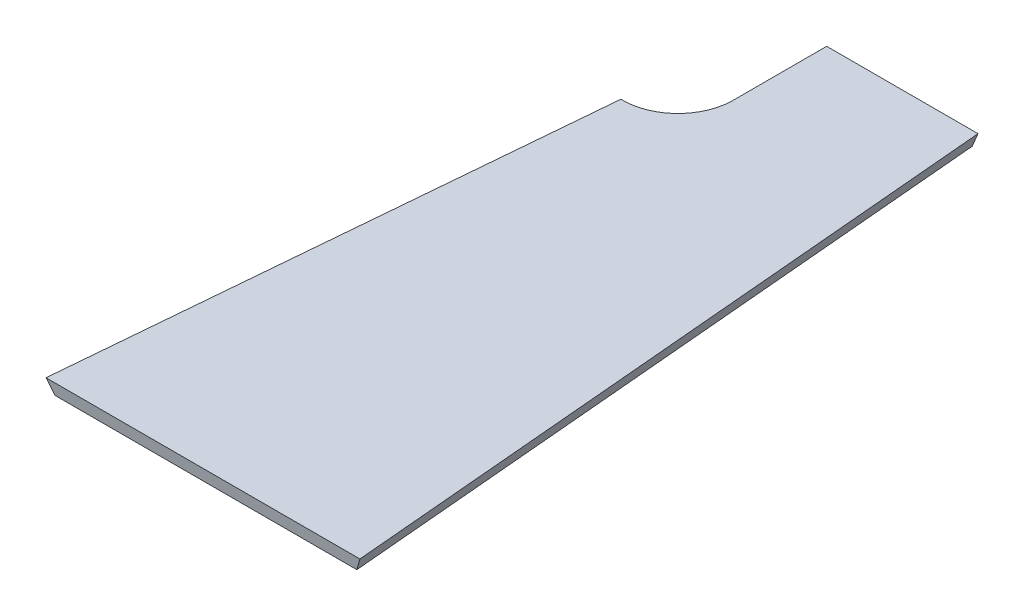
ISO-10303-21;
HEADER;
FILE_DESCRIPTION(('STEP AP214'),'2;1');
FILE_NAME('part.step','',(''),(''),'','','');
FILE_SCHEMA(('AUTOMOTIVE_DESIGN { 1 0 10303 214 1 1 1 1 }'));
ENDSEC;
DATA;
#1=APPLICATION_CONTEXT('core data for automotive mechanical design processes');
#2=APPLICATION_PROTOCOL_DEFINITION('international standard','automotive_design',2000,#1);
#3=PRODUCT_CONTEXT('',#1,'mechanical');
#4=PRODUCT('Part','Part','',(#3));
#5=PRODUCT_RELATED_PRODUCT_CATEGORY('part','',(#4));
#6=PRODUCT_DEFINITION_FORMATION('','',#4);
#7=PRODUCT_DEFINITION_CONTEXT('part definition',#1,'design');
#8=PRODUCT_DEFINITION('design','',#6,#7);
#9=PRODUCT_DEFINITION_SHAPE('','',#8);
#10=(LENGTH_UNIT() NAMED_UNIT(*) SI_UNIT(.MILLI.,.METRE.));
#11=(NAMED_UNIT(*) PLANE_ANGLE_UNIT() SI_UNIT($,.RADIAN.));
#12=(NAMED_UNIT(*) SI_UNIT($,.STERADIAN.) SOLID_ANGLE_UNIT());
#13=UNCERTAINTY_MEASURE_WITH_UNIT(LENGTH_MEASURE(1.E-05),#10,'distance_accuracy_value','');
#14=(GEOMETRIC_REPRESENTATION_CONTEXT(3) GLOBAL_UNCERTAINTY_ASSIGNED_CONTEXT((#13)) GLOBAL_UNIT_ASSIGNED_CONTEXT((#10,
#11,#12)) REPRESENTATION_CONTEXT('',''));
#15=CARTESIAN_POINT('',(0.,0.,0.));
#16=DIRECTION('',(0.,0.,1.));
#17=DIRECTION('',(1.,0.,0.));
#18=AXIS2_PLACEMENT_3D('',#15,#16,#17);
#19=CARTESIAN_POINT('',(-28.5,2.5,-61.5));
#20=DIRECTION('',(0.,0.,1.));
#21=DIRECTION('',(1.,0.,0.));
#22=AXIS2_PLACEMENT_3D('',#19,#20,#21);
#23=PLANE('',#22);
#24=DIRECTION('',(-1.,0.,0.));
#25=VECTOR('',#24,1.);
#26=CARTESIAN_POINT('',(-28.5,0.,-61.5));
#27=LINE('',#26,#25);
#28=CARTESIAN_POINT('',(16.6994049090877,0.,-61.5));
#29=VERTEX_POINT('',#28);
#30=CARTESIAN_POINT('',(-9.73889438631091,0.,-61.5));
#31=VERTEX_POINT('',#30);
#32=EDGE_CURVE('E168',#29,#31,#27,.T.);
#33=ORIENTED_EDGE('',*,*,#32,.T.);
#34=DIRECTION('',(0.,1.,0.));
#35=VECTOR('',#34,1.);
#36=CARTESIAN_POINT('',(-9.73889438631091,0.,-61.5));
#37=LINE('',#36,#35);
#38=CARTESIAN_POINT('',(-9.73889438631091,2.5,-61.5));
#39=VERTEX_POINT('',#38);
#40=EDGE_CURVE('E113',#31,#39,#37,.T.);
#41=ORIENTED_EDGE('',*,*,#40,.T.);
#42=DIRECTION('',(-1.,0.,0.));
#43=VECTOR('',#42,1.);
#44=CARTESIAN_POINT('',(-28.5,2.5,-61.5));
#45=LINE('',#44,#43);
#46=CARTESIAN_POINT('',(17.7388943863118,2.5,-61.5));
#47=VERTEX_POINT('',#46);
#48=EDGE_CURVE('E169',#47,#39,#45,.T.);
#49=ORIENTED_EDGE('',*,*,#48,.F.);
#50=DIRECTION('',(-0.383930099614951,-0.92336216004862,0.));
#51=VECTOR('',#50,1.);
#52=CARTESIAN_POINT('',(10.9231740152463,-13.8919898190479,-61.5));
#53=LINE('',#52,#51);
#54=EDGE_CURVE('E155',#47,#29,#53,.T.);
#55=ORIENTED_EDGE('',*,*,#54,.T.);
#56=EDGE_LOOP('',(#33,#41,#49,#55));
#57=FACE_BOUND('',#56,.T.);
#58=ADVANCED_FACE('F44',(#57),#23,.F.);
#59=CARTESIAN_POINT('',(0.,2.5,0.));
#60=DIRECTION('',(0.,-1.,0.));
#61=DIRECTION('',(0.,0.,-1.));
#62=AXIS2_PLACEMENT_3D('',#59,#60,#61);
#63=PLANE('',#62);
#64=ORIENTED_EDGE('',*,*,#48,.T.);
#65=DIRECTION('',(0.,0.,-1.));
#66=VECTOR('',#65,1.);
#67=CARTESIAN_POINT('',(-9.73889438631091,2.5,-61.5));
#68=LINE('',#67,#66);
#69=CARTESIAN_POINT('',(-9.73889438631091,2.5,-44.5));
#70=VERTEX_POINT('',#69);
#71=EDGE_CURVE('E129',#70,#39,#68,.T.);
#72=ORIENTED_EDGE('',*,*,#71,.F.);
#73=CARTESIAN_POINT('',(-19.7388943863109,2.5,-44.5));
#74=DIRECTION('',(0.,1.,0.));
#75=DIRECTION('',(0.,0.,1.));
#76=AXIS2_PLACEMENT_3D('',#73,#74,#75);
#77=CIRCLE('',#76,10.);
#78=CARTESIAN_POINT('',(-19.7388943863109,2.5,-34.5));
#79=VERTEX_POINT('',#78);
#80=EDGE_CURVE('E109',#79,#70,#77,.T.);
#81=ORIENTED_EDGE('',*,*,#80,.F.);
#82=DIRECTION('',(1.,0.,0.));
#83=VECTOR('',#82,1.);
#84=CARTESIAN_POINT('',(-19.7388943863109,2.5,-34.5));
#85=LINE('',#84,#83);
#86=CARTESIAN_POINT('',(-20.101088301511,2.5,-34.5));
#87=VERTEX_POINT('',#86);
#88=EDGE_CURVE('E134',#87,#79,#85,.T.);
#89=ORIENTED_EDGE('',*,*,#88,.F.);
#90=DIRECTION('',(0.0871557427476617,0.,-0.996194698091745));
#91=VECTOR('',#90,1.);
#92=CARTESIAN_POINT('',(-28.5,2.5,61.5));
#93=LINE('',#92,#91);
#94=CARTESIAN_POINT('',(-28.5,2.5,61.5));
#95=VERTEX_POINT('',#94);
#96=EDGE_CURVE('E160',#95,#87,#93,.T.);
#97=ORIENTED_EDGE('',*,*,#96,.F.);
#98=DIRECTION('',(1.,0.,0.));
#99=VECTOR('',#98,1.);
#100=CARTESIAN_POINT('',(-28.5,2.5,61.5));
#101=LINE('',#100,#99);
#102=CARTESIAN_POINT('',(28.5,2.5,61.5));
#103=VERTEX_POINT('',#102);
#104=EDGE_CURVE('E173',#95,#103,#101,.T.);
#105=ORIENTED_EDGE('',*,*,#104,.T.);
#106=DIRECTION('',(0.0871557427476548,0.,0.996194698091746));
#107=VECTOR('',#106,1.);
#108=CARTESIAN_POINT('',(28.5,2.5,61.5));
#109=LINE('',#108,#107);
#110=EDGE_CURVE('E159',#47,#103,#109,.T.);
#111=ORIENTED_EDGE('',*,*,#110,.F.);
#112=EDGE_LOOP('',(#64,#72,#81,#89,#97,#105,#111));
#113=FACE_BOUND('',#112,.T.);
#114=ADVANCED_FACE('F184',(#113),#63,.F.);
#115=CARTESIAN_POINT('',(0.,0.,0.));
#116=DIRECTION('',(0.,-1.,0.));
#117=DIRECTION('',(0.,0.,-1.));
#118=AXIS2_PLACEMENT_3D('',#115,#116,#117);
#119=PLANE('',#118);
#120=DIRECTION('',(0.,0.,-1.));
#121=VECTOR('',#120,1.);
#122=CARTESIAN_POINT('',(-9.73889438631091,0.,-61.5));
#123=LINE('',#122,#121);
#124=CARTESIAN_POINT('',(-9.73889438631091,0.,-44.5));
#125=VERTEX_POINT('',#124);
#126=EDGE_CURVE('E116',#125,#31,#123,.T.);
#127=ORIENTED_EDGE('',*,*,#126,.T.);
#128=ORIENTED_EDGE('',*,*,#32,.F.);
#129=DIRECTION('',(0.0871557427476548,0.,0.996194698091746));
#130=VECTOR('',#129,1.);
#131=CARTESIAN_POINT('',(16.3560646475477,0.,-65.4243971470463));
#132=LINE('',#131,#130);
#133=CARTESIAN_POINT('',(27.4140197990155,0.,60.9686085958249));
#134=VERTEX_POINT('',#133);
#135=EDGE_CURVE('E147',#29,#134,#132,.T.);
#136=ORIENTED_EDGE('',*,*,#135,.T.);
#137=DIRECTION('',(1.,0.,0.));
#138=VECTOR('',#137,1.);
#139=CARTESIAN_POINT('',(-28.5,0.,60.9686085958249));
#140=LINE('',#139,#138);
#141=CARTESIAN_POINT('',(-27.4140197990155,0.,60.968608595825));
#142=VERTEX_POINT('',#141);
#143=EDGE_CURVE('E163',#142,#134,#140,.T.);
#144=ORIENTED_EDGE('',*,*,#143,.F.);
#145=DIRECTION('',(-0.0871557427476618,0.,0.996194698091745));
#146=VECTOR('',#145,1.);
#147=CARTESIAN_POINT('',(-16.3560646475468,0.,-65.4243971470465));
#148=LINE('',#147,#146);
#149=CARTESIAN_POINT('',(-19.0595778159344,0.,-34.5231002311734));
#150=VERTEX_POINT('',#149);
#151=EDGE_CURVE('E127',#150,#142,#148,.T.);
#152=ORIENTED_EDGE('',*,*,#151,.F.);
#153=CARTESIAN_POINT('',(-19.7388943863109,0.,-44.5));
#154=DIRECTION('',(0.,1.,0.));
#155=DIRECTION('',(0.,0.,1.));
#156=AXIS2_PLACEMENT_3D('',#153,#154,#155);
#157=CIRCLE('',#156,10.);
#158=EDGE_CURVE('E107',#150,#125,#157,.T.);
#159=ORIENTED_EDGE('',*,*,#158,.T.);
#160=EDGE_LOOP('',(#127,#128,#136,#144,#152,#159));
#161=FACE_BOUND('',#160,.T.);
#162=ADVANCED_FACE('F125',(#161),#119,.T.);
#163=CARTESIAN_POINT('',(-28.5,0.,60.9686085958249));
#164=DIRECTION('',(0.,0.207911690817761,-0.978147600733805));
#165=DIRECTION('',(0.,0.978147600733805,0.207911690817761));
#166=AXIS2_PLACEMENT_3D('',#163,#164,#165);
#167=PLANE('',#166);
#168=ORIENTED_EDGE('',*,*,#104,.F.);
#169=DIRECTION('',(0.391062348992312,-0.900252022637708,-0.191354474568356));
#170=VECTOR('',#169,1.);
#171=CARTESIAN_POINT('',(-27.580098491385,0.382324401998462,61.0498741561563));
#172=LINE('',#171,#170);
#173=EDGE_CURVE('E68',#95,#142,#172,.T.);
#174=ORIENTED_EDGE('',*,*,#173,.T.);
#175=ORIENTED_EDGE('',*,*,#143,.T.);
#176=DIRECTION('',(0.391062348992305,0.900252022637711,0.191354474568357));
#177=VECTOR('',#176,1.);
#178=CARTESIAN_POINT('',(18.8631021258203,-19.6847918254948,56.7844769282076));
#179=LINE('',#178,#177);
#180=EDGE_CURVE('E151',#134,#103,#179,.T.);
#181=ORIENTED_EDGE('',*,*,#180,.T.);
#182=EDGE_LOOP('',(#168,#174,#175,#181));
#183=FACE_BOUND('',#182,.T.);
#184=ADVANCED_FACE('F193',(#183),#167,.F.);
#185=CARTESIAN_POINT('',(16.3560646475477,0.,-65.4243971470463));
#186=DIRECTION('',(-0.920363891963226,0.382683432365086,0.0805214068653775));
#187=DIRECTION('',(-0.383930099614951,-0.92336216004862,0.));
#188=AXIS2_PLACEMENT_3D('',#185,#186,#187);
#189=PLANE('',#188);
#190=ORIENTED_EDGE('',*,*,#110,.T.);
#191=ORIENTED_EDGE('',*,*,#180,.F.);
#192=ORIENTED_EDGE('',*,*,#135,.F.);
#193=ORIENTED_EDGE('',*,*,#54,.F.);
#194=EDGE_LOOP('',(#190,#191,#192,#193));
#195=FACE_BOUND('',#194,.T.);
#196=ADVANCED_FACE('F191',(#195),#189,.F.);
#197=CARTESIAN_POINT('',(-17.3876580343312,2.5,-65.5146498737584));
#198=DIRECTION('',(0.920363891963223,0.382683432365092,0.0805214068653837));
#199=DIRECTION('',(-0.383930099614957,0.923362160048618,0.));
#200=AXIS2_PLACEMENT_3D('',#197,#198,#199);
#201=PLANE('',#200);
#202=DIRECTION('',(0.383930099614957,-0.923362160048618,0.));
#203=VECTOR('',#202,1.);
#204=CARTESIAN_POINT('',(-19.7011223811979,1.5380712621999,-34.5));
#205=LINE('',#204,#203);
#206=CARTESIAN_POINT('',(-19.7388943863109,1.62891394493167,-34.5));
#207=VERTEX_POINT('',#206);
#208=EDGE_CURVE('E52',#87,#207,#205,.T.);
#209=ORIENTED_EDGE('',*,*,#208,.T.);
#210=CARTESIAN_POINT('',(-19.7388943863109,3.73303970673271,-44.5));
#211=DIRECTION('',(0.920363891963223,0.382683432365092,0.0805214068653837));
#212=DIRECTION('',(-0.381227206369655,0.923879532511286,-0.0333530587850041));
#213=AXIS2_PLACEMENT_3D('',#210,#211,#212);
#214=ELLIPSE('',#213,26.1312592975274,10.);
#215=EDGE_CURVE('E11',#207,#150,#214,.T.);
#216=ORIENTED_EDGE('',*,*,#215,.T.);
#217=ORIENTED_EDGE('',*,*,#151,.T.);
#218=ORIENTED_EDGE('',*,*,#173,.F.);
#219=ORIENTED_EDGE('',*,*,#96,.T.);
#220=EDGE_LOOP('',(#209,#216,#217,#218,#219));
#221=FACE_BOUND('',#220,.T.);
#222=ADVANCED_FACE('F180',(#221),#201,.F.);
#223=CARTESIAN_POINT('',(-19.7388943863109,0.,-44.5));
#224=DIRECTION('',(0.,1.,0.));
#225=DIRECTION('',(0.,0.,1.));
#226=AXIS2_PLACEMENT_3D('',#223,#224,#225);
#227=CYLINDRICAL_SURFACE('',#226,10.);
#228=DIRECTION('',(0.,1.,0.));
#229=VECTOR('',#228,1.);
#230=CARTESIAN_POINT('',(-19.7388943863109,0.,-34.5));
#231=LINE('',#230,#229);
#232=EDGE_CURVE('E59',#207,#79,#231,.T.);
#233=ORIENTED_EDGE('',*,*,#232,.T.);
#234=ORIENTED_EDGE('',*,*,#80,.T.);
#235=DIRECTION('',(0.,1.,0.));
#236=VECTOR('',#235,1.);
#237=CARTESIAN_POINT('',(-9.73889438631091,0.,-44.5));
#238=LINE('',#237,#236);
#239=EDGE_CURVE('E103',#125,#70,#238,.T.);
#240=ORIENTED_EDGE('',*,*,#239,.F.);
#241=ORIENTED_EDGE('',*,*,#158,.F.);
#242=ORIENTED_EDGE('',*,*,#215,.F.);
#243=EDGE_LOOP('',(#233,#234,#240,#241,#242));
#244=FACE_BOUND('',#243,.T.);
#245=ADVANCED_FACE('F105',(#244),#227,.F.);
#246=CARTESIAN_POINT('',(-19.7388943863109,0.,-34.5));
#247=DIRECTION('',(0.,0.,1.));
#248=DIRECTION('',(1.,0.,0.));
#249=AXIS2_PLACEMENT_3D('',#246,#247,#248);
#250=PLANE('',#249);
#251=ORIENTED_EDGE('',*,*,#88,.T.);
#252=ORIENTED_EDGE('',*,*,#232,.F.);
#253=ORIENTED_EDGE('',*,*,#208,.F.);
#254=EDGE_LOOP('',(#251,#252,#253));
#255=FACE_BOUND('',#254,.T.);
#256=ADVANCED_FACE('F182',(#255),#250,.F.);
#257=CARTESIAN_POINT('',(-9.73889438631091,0.,-61.5));
#258=DIRECTION('',(1.,0.,0.));
#259=DIRECTION('',(0.,0.,-1.));
#260=AXIS2_PLACEMENT_3D('',#257,#258,#259);
#261=PLANE('',#260);
#262=ORIENTED_EDGE('',*,*,#71,.T.);
#263=ORIENTED_EDGE('',*,*,#40,.F.);
#264=ORIENTED_EDGE('',*,*,#126,.F.);
#265=ORIENTED_EDGE('',*,*,#239,.T.);
#266=EDGE_LOOP('',(#262,#263,#264,#265));
#267=FACE_BOUND('',#266,.T.);
#268=ADVANCED_FACE('F117',(#267),#261,.F.);
#269=CLOSED_SHELL('',(#58,#114,#162,#184,#196,#222,#245,#256,#268));
#270=MANIFOLD_SOLID_BREP('B2',#269);
#271=ADVANCED_BREP_SHAPE_REPRESENTATION('',(#18,#270),#14);
#272=SHAPE_DEFINITION_REPRESENTATION(#9,#271);
ENDSEC;
END-ISO-10303-21;
